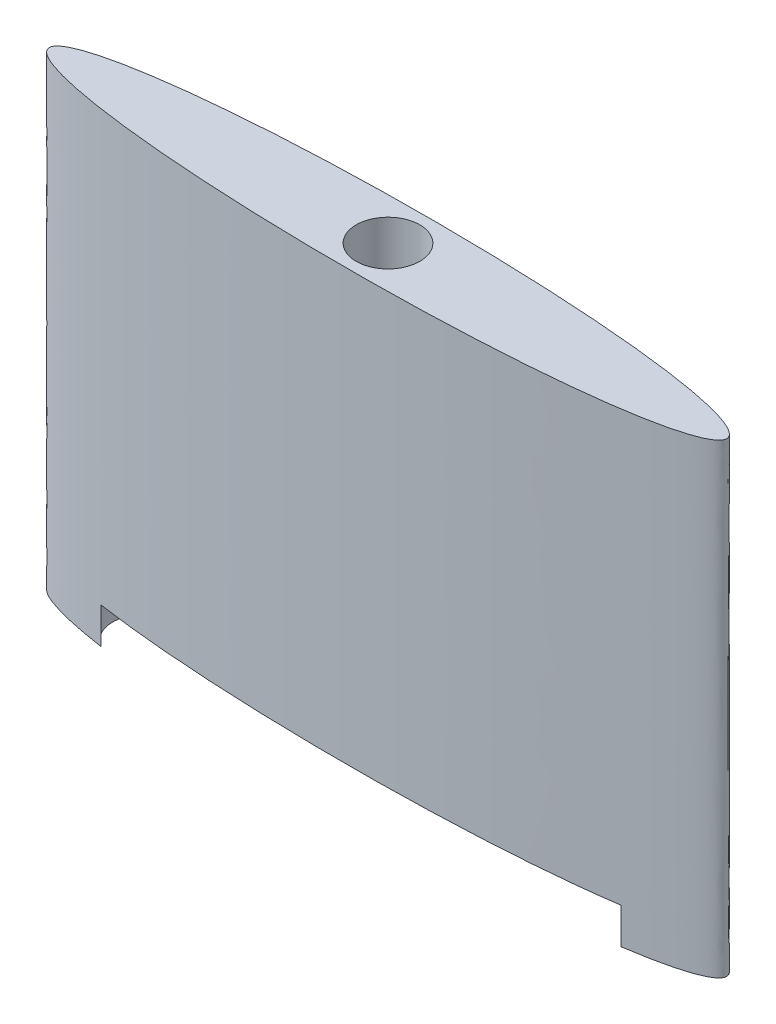
ISO-10303-21;
HEADER;
FILE_DESCRIPTION(('STEP AP214'),'2;1');
FILE_NAME('part.step','',(''),(''),'','','');
FILE_SCHEMA(('AUTOMOTIVE_DESIGN { 1 0 10303 214 1 1 1 1 }'));
ENDSEC;
DATA;
#1=APPLICATION_CONTEXT('core data for automotive mechanical design processes');
#2=APPLICATION_PROTOCOL_DEFINITION('international standard','automotive_design',2000,#1);
#3=PRODUCT_CONTEXT('',#1,'mechanical');
#4=PRODUCT('Part','Part','',(#3));
#5=PRODUCT_RELATED_PRODUCT_CATEGORY('part','',(#4));
#6=PRODUCT_DEFINITION_FORMATION('','',#4);
#7=PRODUCT_DEFINITION_CONTEXT('part definition',#1,'design');
#8=PRODUCT_DEFINITION('design','',#6,#7);
#9=PRODUCT_DEFINITION_SHAPE('','',#8);
#10=(LENGTH_UNIT() NAMED_UNIT(*) SI_UNIT(.MILLI.,.METRE.));
#11=(NAMED_UNIT(*) PLANE_ANGLE_UNIT() SI_UNIT($,.RADIAN.));
#12=(NAMED_UNIT(*) SI_UNIT($,.STERADIAN.) SOLID_ANGLE_UNIT());
#13=UNCERTAINTY_MEASURE_WITH_UNIT(LENGTH_MEASURE(1.E-05),#10,'distance_accuracy_value','');
#14=(GEOMETRIC_REPRESENTATION_CONTEXT(3) GLOBAL_UNCERTAINTY_ASSIGNED_CONTEXT((#13)) GLOBAL_UNIT_ASSIGNED_CONTEXT((#10,
#11,#12)) REPRESENTATION_CONTEXT('',''));
#15=CARTESIAN_POINT('',(0.,0.,0.));
#16=DIRECTION('',(0.,0.,1.));
#17=DIRECTION('',(1.,0.,0.));
#18=AXIS2_PLACEMENT_3D('',#15,#16,#17);
#19=CARTESIAN_POINT('',(0.,22.,0.));
#20=DIRECTION('',(0.,1.,0.));
#21=DIRECTION('',(1.,0.,0.));
#22=AXIS2_PLACEMENT_3D('',#19,#20,#21);
#23=ELLIPSE('',#22,16.,2.);
#24=DIRECTION('',(0.,-1.,0.));
#25=VECTOR('',#24,1.);
#26=SURFACE_OF_LINEAR_EXTRUSION('',#23,#25);
#27=CARTESIAN_POINT('',(16.,22.,0.));
#28=VERTEX_POINT('',#27);
#29=EDGE_CURVE('E83',#28,#28,#23,.T.);
#30=ORIENTED_EDGE('',*,*,#29,.F.);
#31=EDGE_LOOP('',(#30));
#32=FACE_BOUND('',#31,.T.);
#33=DIRECTION('',(0.,-1.,0.));
#34=VECTOR('',#33,1.);
#35=CARTESIAN_POINT('',(-12.2781480329935,22.,1.28237499926831));
#36=LINE('',#35,#34);
#37=CARTESIAN_POINT('',(-12.2781480329935,1.7,1.28237499926831));
#38=VERTEX_POINT('',#37);
#39=CARTESIAN_POINT('',(-12.2781480329935,0.,1.28237499926831));
#40=VERTEX_POINT('',#39);
#41=EDGE_CURVE('E88',#38,#40,#36,.T.);
#42=ORIENTED_EDGE('',*,*,#41,.F.);
#43=CARTESIAN_POINT('',(0.,1.7,0.));
#44=DIRECTION('',(0.,1.,0.));
#45=DIRECTION('',(1.,0.,0.));
#46=AXIS2_PLACEMENT_3D('',#43,#44,#45);
#47=ELLIPSE('',#46,16.,2.);
#48=CARTESIAN_POINT('',(12.2781480329935,1.7,1.28237499926831));
#49=VERTEX_POINT('',#48);
#50=EDGE_CURVE('E11',#38,#49,#47,.T.);
#51=ORIENTED_EDGE('',*,*,#50,.T.);
#52=DIRECTION('',(0.,-1.,0.));
#53=VECTOR('',#52,1.);
#54=CARTESIAN_POINT('',(12.2781480329935,22.,1.28237499926832));
#55=LINE('',#54,#53);
#56=CARTESIAN_POINT('',(12.2781480329935,0.,1.28237499926831));
#57=VERTEX_POINT('',#56);
#58=EDGE_CURVE('E78',#57,#49,#55,.F.);
#59=ORIENTED_EDGE('',*,*,#58,.F.);
#60=CARTESIAN_POINT('',(0.,0.,0.));
#61=DIRECTION('',(0.,1.,0.));
#62=DIRECTION('',(1.,0.,0.));
#63=AXIS2_PLACEMENT_3D('',#60,#61,#62);
#64=ELLIPSE('',#63,16.,2.);
#65=CARTESIAN_POINT('',(12.2781480329935,0.,-1.28237499926832));
#66=VERTEX_POINT('',#65);
#67=EDGE_CURVE('E87',#57,#66,#64,.T.);
#68=ORIENTED_EDGE('',*,*,#67,.T.);
#69=DIRECTION('',(0.,-1.,0.));
#70=VECTOR('',#69,1.);
#71=CARTESIAN_POINT('',(12.2781480329935,22.,-1.28237499926832));
#72=LINE('',#71,#70);
#73=CARTESIAN_POINT('',(12.2781480329935,1.7,-1.28237499926831));
#74=VERTEX_POINT('',#73);
#75=EDGE_CURVE('E51',#74,#66,#72,.T.);
#76=ORIENTED_EDGE('',*,*,#75,.F.);
#77=CARTESIAN_POINT('',(-12.2781480329935,1.7,-1.28237499926831));
#78=VERTEX_POINT('',#77);
#79=EDGE_CURVE('E40',#74,#78,#47,.T.);
#80=ORIENTED_EDGE('',*,*,#79,.T.);
#81=DIRECTION('',(0.,-1.,0.));
#82=VECTOR('',#81,1.);
#83=CARTESIAN_POINT('',(-12.2781480329935,22.,-1.28237499926832));
#84=LINE('',#83,#82);
#85=CARTESIAN_POINT('',(-12.2781480329935,0.,-1.28237499926831));
#86=VERTEX_POINT('',#85);
#87=EDGE_CURVE('E92',#86,#78,#84,.F.);
#88=ORIENTED_EDGE('',*,*,#87,.F.);
#89=EDGE_CURVE('E91',#86,#40,#64,.T.);
#90=ORIENTED_EDGE('',*,*,#89,.T.);
#91=EDGE_LOOP('',(#42,#51,#59,#68,#76,#80,#88,#90));
#92=FACE_BOUND('',#91,.T.);
#93=ADVANCED_FACE('F36',(#32,#92),#26,.F.);
#94=CARTESIAN_POINT('',(0.,0.,0.));
#95=DIRECTION('',(0.,1.,0.));
#96=DIRECTION('',(0.,0.,1.));
#97=AXIS2_PLACEMENT_3D('',#94,#95,#96);
#98=PLANE('',#97);
#99=CARTESIAN_POINT('',(-11.5,0.,0.));
#100=DIRECTION('',(0.,1.,0.));
#101=DIRECTION('',(0.,0.,1.));
#102=AXIS2_PLACEMENT_3D('',#99,#100,#101);
#103=CIRCLE('',#102,1.5);
#104=EDGE_CURVE('E82',#40,#86,#103,.F.);
#105=ORIENTED_EDGE('',*,*,#104,.F.);
#106=ORIENTED_EDGE('',*,*,#89,.F.);
#107=EDGE_LOOP('',(#105,#106));
#108=FACE_BOUND('',#107,.T.);
#109=ADVANCED_FACE('F113',(#108),#98,.F.);
#110=CARTESIAN_POINT('',(0.,22.,0.));
#111=DIRECTION('',(0.,1.,0.));
#112=DIRECTION('',(0.,0.,1.));
#113=AXIS2_PLACEMENT_3D('',#110,#111,#112);
#114=PLANE('',#113);
#115=CARTESIAN_POINT('',(0.,22.,0.));
#116=DIRECTION('',(0.,1.,0.));
#117=DIRECTION('',(0.,0.,1.));
#118=AXIS2_PLACEMENT_3D('',#115,#116,#117);
#119=CIRCLE('',#118,1.5);
#120=CARTESIAN_POINT('',(0.,22.,1.5));
#121=VERTEX_POINT('',#120);
#122=EDGE_CURVE('E151',#121,#121,#119,.T.);
#123=ORIENTED_EDGE('',*,*,#122,.F.);
#124=EDGE_LOOP('',(#123));
#125=FACE_BOUND('',#124,.T.);
#126=ORIENTED_EDGE('',*,*,#29,.T.);
#127=EDGE_LOOP('',(#126));
#128=FACE_BOUND('',#127,.T.);
#129=ADVANCED_FACE('F115',(#125,#128),#114,.T.);
#130=CARTESIAN_POINT('',(11.5,0.,0.));
#131=DIRECTION('',(0.,1.,0.));
#132=DIRECTION('',(0.,0.,1.));
#133=AXIS2_PLACEMENT_3D('',#130,#131,#132);
#134=CIRCLE('',#133,1.5);
#135=EDGE_CURVE('E75',#66,#57,#134,.F.);
#136=ORIENTED_EDGE('',*,*,#135,.F.);
#137=ORIENTED_EDGE('',*,*,#67,.F.);
#138=EDGE_LOOP('',(#136,#137));
#139=FACE_BOUND('',#138,.T.);
#140=ADVANCED_FACE('F90',(#139),#98,.F.);
#141=CARTESIAN_POINT('',(0.,1.7,0.));
#142=DIRECTION('',(0.,1.,0.));
#143=DIRECTION('',(0.,0.,1.));
#144=AXIS2_PLACEMENT_3D('',#141,#142,#143);
#145=PLANE('',#144);
#146=CARTESIAN_POINT('',(11.5,1.7,0.));
#147=DIRECTION('',(0.,1.,0.));
#148=DIRECTION('',(0.,0.,-1.));
#149=AXIS2_PLACEMENT_3D('',#146,#147,#148);
#150=CIRCLE('',#149,1.5);
#151=EDGE_CURVE('E103',#49,#74,#150,.T.);
#152=ORIENTED_EDGE('',*,*,#151,.F.);
#153=ORIENTED_EDGE('',*,*,#50,.F.);
#154=CARTESIAN_POINT('',(-11.5,1.7,0.));
#155=DIRECTION('',(0.,1.,0.));
#156=DIRECTION('',(0.,0.,1.));
#157=AXIS2_PLACEMENT_3D('',#154,#155,#156);
#158=CIRCLE('',#157,1.5);
#159=EDGE_CURVE('E104',#78,#38,#158,.T.);
#160=ORIENTED_EDGE('',*,*,#159,.F.);
#161=ORIENTED_EDGE('',*,*,#79,.F.);
#162=EDGE_LOOP('',(#152,#153,#160,#161));
#163=FACE_BOUND('',#162,.T.);
#164=ADVANCED_FACE('F102',(#163),#145,.F.);
#165=CARTESIAN_POINT('',(-11.5,1.7,0.));
#166=DIRECTION('',(0.,-1.,0.));
#167=DIRECTION('',(0.,0.,-1.));
#168=AXIS2_PLACEMENT_3D('',#165,#166,#167);
#169=CYLINDRICAL_SURFACE('',#168,1.5);
#170=ORIENTED_EDGE('',*,*,#87,.T.);
#171=ORIENTED_EDGE('',*,*,#159,.T.);
#172=ORIENTED_EDGE('',*,*,#41,.T.);
#173=ORIENTED_EDGE('',*,*,#104,.T.);
#174=EDGE_LOOP('',(#170,#171,#172,#173));
#175=FACE_BOUND('',#174,.T.);
#176=ADVANCED_FACE('F111',(#175),#169,.F.);
#177=CARTESIAN_POINT('',(11.5,1.7,0.));
#178=DIRECTION('',(0.,-1.,0.));
#179=DIRECTION('',(0.,0.,-1.));
#180=AXIS2_PLACEMENT_3D('',#177,#178,#179);
#181=CYLINDRICAL_SURFACE('',#180,1.5);
#182=ORIENTED_EDGE('',*,*,#58,.T.);
#183=ORIENTED_EDGE('',*,*,#151,.T.);
#184=ORIENTED_EDGE('',*,*,#75,.T.);
#185=ORIENTED_EDGE('',*,*,#135,.T.);
#186=EDGE_LOOP('',(#182,#183,#184,#185));
#187=FACE_BOUND('',#186,.T.);
#188=ADVANCED_FACE('F77',(#187),#181,.F.);
#189=CARTESIAN_POINT('',(0.,12.,0.));
#190=DIRECTION('',(0.,1.,0.));
#191=DIRECTION('',(0.,0.,1.));
#192=AXIS2_PLACEMENT_3D('',#189,#190,#191);
#193=CYLINDRICAL_SURFACE('',#192,1.5);
#194=CARTESIAN_POINT('',(0.,12.,0.));
#195=DIRECTION('',(0.,1.,0.));
#196=DIRECTION('',(0.,0.,1.));
#197=AXIS2_PLACEMENT_3D('',#194,#195,#196);
#198=CIRCLE('',#197,1.5);
#199=CARTESIAN_POINT('',(0.,12.,1.5));
#200=VERTEX_POINT('',#199);
#201=EDGE_CURVE('E107',#200,#200,#198,.T.);
#202=ORIENTED_EDGE('',*,*,#201,.F.);
#203=EDGE_LOOP('',(#202));
#204=FACE_BOUND('',#203,.T.);
#205=ORIENTED_EDGE('',*,*,#122,.T.);
#206=EDGE_LOOP('',(#205));
#207=FACE_BOUND('',#206,.T.);
#208=ADVANCED_FACE('F134',(#204,#207),#193,.F.);
#209=CARTESIAN_POINT('',(0.,12.,0.));
#210=DIRECTION('',(0.,1.,0.));
#211=DIRECTION('',(0.,0.,1.));
#212=AXIS2_PLACEMENT_3D('',#209,#210,#211);
#213=PLANE('',#212);
#214=ORIENTED_EDGE('',*,*,#201,.T.);
#215=EDGE_LOOP('',(#214));
#216=FACE_BOUND('',#215,.T.);
#217=ADVANCED_FACE('F140',(#216),#213,.T.);
#218=CLOSED_SHELL('',(#93,#109,#129,#140,#164,#176,#188,#208,#217));
#219=MANIFOLD_SOLID_BREP('B2',#218);
#220=ADVANCED_BREP_SHAPE_REPRESENTATION('',(#18,#219),#14);
#221=SHAPE_DEFINITION_REPRESENTATION(#9,#220);
ENDSEC;
END-ISO-10303-21;
